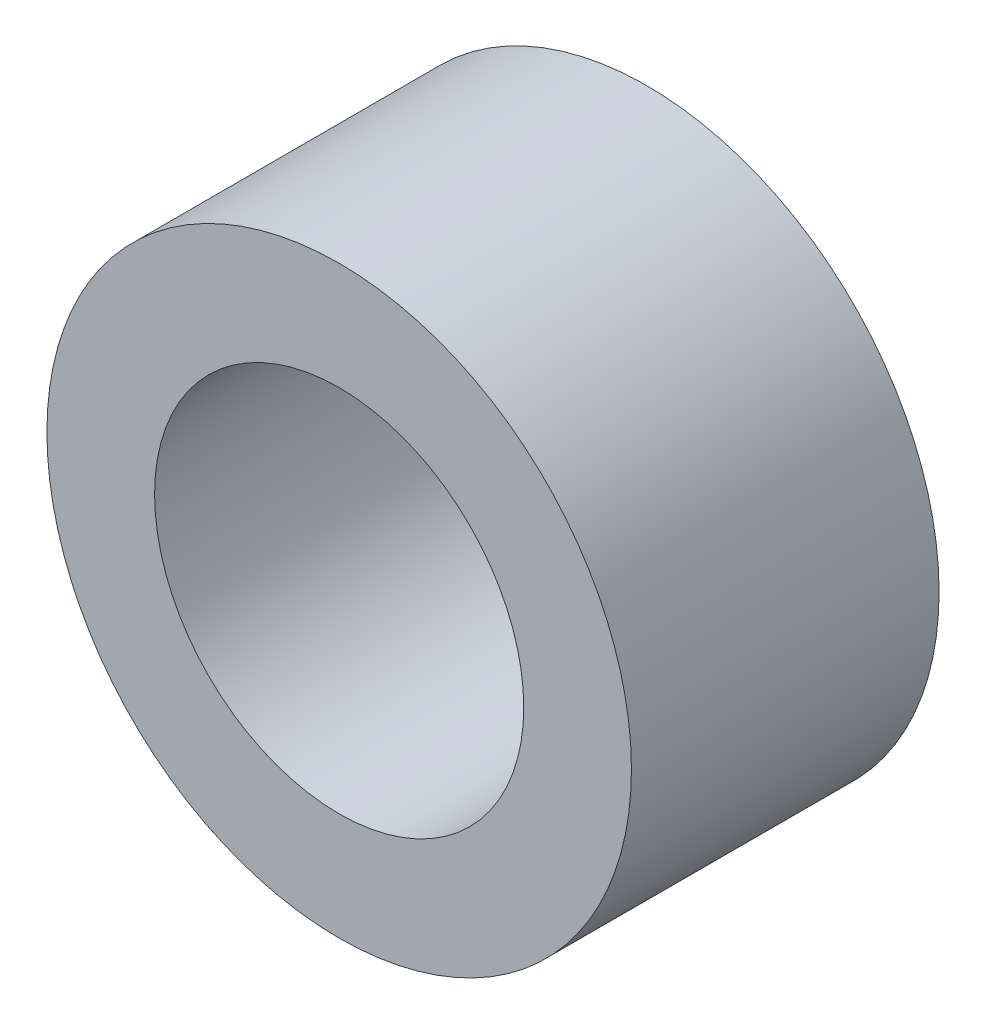
ISO-10303-21;
HEADER;
FILE_DESCRIPTION(('STEP AP214'),'2;1');
FILE_NAME('part.step','',(''),(''),'','','');
FILE_SCHEMA(('AUTOMOTIVE_DESIGN { 1 0 10303 214 1 1 1 1 }'));
ENDSEC;
DATA;
#1=APPLICATION_CONTEXT('core data for automotive mechanical design processes');
#2=APPLICATION_PROTOCOL_DEFINITION('international standard','automotive_design',2000,#1);
#3=PRODUCT_CONTEXT('',#1,'mechanical');
#4=PRODUCT('Part','Part','',(#3));
#5=PRODUCT_RELATED_PRODUCT_CATEGORY('part','',(#4));
#6=PRODUCT_DEFINITION_FORMATION('','',#4);
#7=PRODUCT_DEFINITION_CONTEXT('part definition',#1,'design');
#8=PRODUCT_DEFINITION('design','',#6,#7);
#9=PRODUCT_DEFINITION_SHAPE('','',#8);
#10=(LENGTH_UNIT() NAMED_UNIT(*) SI_UNIT(.MILLI.,.METRE.));
#11=(NAMED_UNIT(*) PLANE_ANGLE_UNIT() SI_UNIT($,.RADIAN.));
#12=(NAMED_UNIT(*) SI_UNIT($,.STERADIAN.) SOLID_ANGLE_UNIT());
#13=UNCERTAINTY_MEASURE_WITH_UNIT(LENGTH_MEASURE(1.E-05),#10,'distance_accuracy_value','');
#14=(GEOMETRIC_REPRESENTATION_CONTEXT(3) GLOBAL_UNCERTAINTY_ASSIGNED_CONTEXT((#13)) GLOBAL_UNIT_ASSIGNED_CONTEXT((#10,
#11,#12)) REPRESENTATION_CONTEXT('',''));
#15=CARTESIAN_POINT('',(0.,0.,0.));
#16=DIRECTION('',(0.,0.,1.));
#17=DIRECTION('',(1.,0.,0.));
#18=AXIS2_PLACEMENT_3D('',#15,#16,#17);
#19=CARTESIAN_POINT('',(-4.75,-4.75,0.));
#20=DIRECTION('',(0.,0.,1.));
#21=DIRECTION('',(1.,0.,0.));
#22=AXIS2_PLACEMENT_3D('',#19,#20,#21);
#23=PLANE('',#22);
#24=CARTESIAN_POINT('',(0.,0.,0.));
#25=DIRECTION('',(0.,0.,1.));
#26=DIRECTION('',(-1.,0.,0.));
#27=AXIS2_PLACEMENT_3D('',#24,#25,#26);
#28=CIRCLE('',#27,4.75);
#29=CARTESIAN_POINT('',(-4.75,0.,0.));
#30=VERTEX_POINT('',#29);
#31=EDGE_CURVE('E30',#30,#30,#28,.F.);
#32=ORIENTED_EDGE('',*,*,#31,.F.);
#33=EDGE_LOOP('',(#32));
#34=FACE_BOUND('',#33,.T.);
#35=CARTESIAN_POINT('',(0.,0.,0.));
#36=DIRECTION('',(0.,0.,-1.));
#37=DIRECTION('',(1.,0.,0.));
#38=AXIS2_PLACEMENT_3D('',#35,#36,#37);
#39=CIRCLE('',#38,3.);
#40=CARTESIAN_POINT('',(3.,0.,0.));
#41=VERTEX_POINT('',#40);
#42=EDGE_CURVE('E26',#41,#41,#39,.T.);
#43=ORIENTED_EDGE('',*,*,#42,.T.);
#44=EDGE_LOOP('',(#43));
#45=FACE_BOUND('',#44,.T.);
#46=ADVANCED_FACE('F15',(#34,#45),#23,.T.);
#47=CARTESIAN_POINT('',(4.75000036438651,-4.74999977002295,-5.));
#48=DIRECTION('',(0.,0.,-1.));
#49=DIRECTION('',(-1.,0.,0.));
#50=AXIS2_PLACEMENT_3D('',#47,#48,#49);
#51=PLANE('',#50);
#52=CARTESIAN_POINT('',(0.,0.,-5.));
#53=DIRECTION('',(0.,0.,-1.));
#54=DIRECTION('',(0.99999999999999,-1.41945335672602E-07,0.));
#55=AXIS2_PLACEMENT_3D('',#52,#53,#54);
#56=CIRCLE('',#55,4.75);
#57=CARTESIAN_POINT('',(4.74999999999995,-6.74240344444858E-07,-5.));
#58=VERTEX_POINT('',#57);
#59=EDGE_CURVE('E22',#58,#58,#56,.T.);
#60=ORIENTED_EDGE('',*,*,#59,.T.);
#61=EDGE_LOOP('',(#60));
#62=FACE_BOUND('',#61,.T.);
#63=CARTESIAN_POINT('',(0.,0.,-5.));
#64=DIRECTION('',(0.,0.,1.));
#65=DIRECTION('',(-1.,0.,0.));
#66=AXIS2_PLACEMENT_3D('',#63,#64,#65);
#67=CIRCLE('',#66,3.);
#68=CARTESIAN_POINT('',(-3.,0.,-5.));
#69=VERTEX_POINT('',#68);
#70=EDGE_CURVE('E10',#69,#69,#67,.F.);
#71=ORIENTED_EDGE('',*,*,#70,.F.);
#72=EDGE_LOOP('',(#71));
#73=FACE_BOUND('',#72,.T.);
#74=ADVANCED_FACE('F41',(#62,#73),#51,.T.);
#75=CARTESIAN_POINT('',(0.,0.,-50.));
#76=DIRECTION('',(0.,0.,-1.));
#77=DIRECTION('',(1.,0.,0.));
#78=AXIS2_PLACEMENT_3D('',#75,#76,#77);
#79=CYLINDRICAL_SURFACE('',#78,4.75);
#80=ORIENTED_EDGE('',*,*,#31,.T.);
#81=EDGE_LOOP('',(#80));
#82=FACE_BOUND('',#81,.T.);
#83=ORIENTED_EDGE('',*,*,#59,.F.);
#84=EDGE_LOOP('',(#83));
#85=FACE_BOUND('',#84,.T.);
#86=ADVANCED_FACE('F36',(#82,#85),#79,.T.);
#87=CARTESIAN_POINT('',(0.,0.,-50.));
#88=DIRECTION('',(0.,0.,-1.));
#89=DIRECTION('',(1.,0.,0.));
#90=AXIS2_PLACEMENT_3D('',#87,#88,#89);
#91=CYLINDRICAL_SURFACE('',#90,3.);
#92=ORIENTED_EDGE('',*,*,#70,.T.);
#93=EDGE_LOOP('',(#92));
#94=FACE_BOUND('',#93,.T.);
#95=ORIENTED_EDGE('',*,*,#42,.F.);
#96=EDGE_LOOP('',(#95));
#97=FACE_BOUND('',#96,.T.);
#98=ADVANCED_FACE('F17',(#94,#97),#91,.F.);
#99=CLOSED_SHELL('',(#46,#74,#86,#98));
#100=MANIFOLD_SOLID_BREP('B1',#99);
#101=ADVANCED_BREP_SHAPE_REPRESENTATION('',(#18,#100),#14);
#102=SHAPE_DEFINITION_REPRESENTATION(#9,#101);
ENDSEC;
END-ISO-10303-21;
